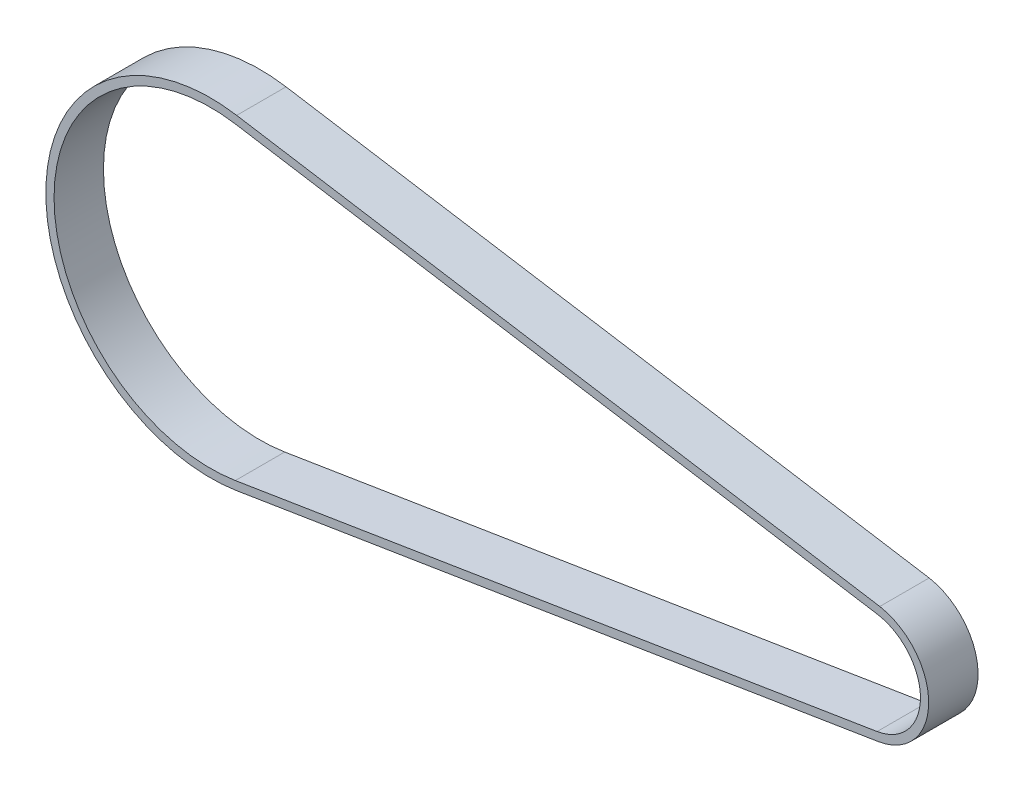
ISO-10303-21;
HEADER;
FILE_DESCRIPTION(('STEP AP214'),'2;1');
FILE_NAME('part.step','',(''),(''),'','','');
FILE_SCHEMA(('AUTOMOTIVE_DESIGN { 1 0 10303 214 1 1 1 1 }'));
ENDSEC;
DATA;
#1=APPLICATION_CONTEXT('core data for automotive mechanical design processes');
#2=APPLICATION_PROTOCOL_DEFINITION('international standard','automotive_design',2000,#1);
#3=PRODUCT_CONTEXT('',#1,'mechanical');
#4=PRODUCT('Part','Part','',(#3));
#5=PRODUCT_RELATED_PRODUCT_CATEGORY('part','',(#4));
#6=PRODUCT_DEFINITION_FORMATION('','',#4);
#7=PRODUCT_DEFINITION_CONTEXT('part definition',#1,'design');
#8=PRODUCT_DEFINITION('design','',#6,#7);
#9=PRODUCT_DEFINITION_SHAPE('','',#8);
#10=(LENGTH_UNIT() NAMED_UNIT(*) SI_UNIT(.MILLI.,.METRE.));
#11=(NAMED_UNIT(*) PLANE_ANGLE_UNIT() SI_UNIT($,.RADIAN.));
#12=(NAMED_UNIT(*) SI_UNIT($,.STERADIAN.) SOLID_ANGLE_UNIT());
#13=UNCERTAINTY_MEASURE_WITH_UNIT(LENGTH_MEASURE(1.E-05),#10,'distance_accuracy_value','');
#14=(GEOMETRIC_REPRESENTATION_CONTEXT(3) GLOBAL_UNCERTAINTY_ASSIGNED_CONTEXT((#13)) GLOBAL_UNIT_ASSIGNED_CONTEXT((#10,
#11,#12)) REPRESENTATION_CONTEXT('',''));
#15=CARTESIAN_POINT('',(0.,0.,0.));
#16=DIRECTION('',(0.,0.,1.));
#17=DIRECTION('',(1.,0.,0.));
#18=AXIS2_PLACEMENT_3D('',#15,#16,#17);
#19=CARTESIAN_POINT('',(0.,0.,6.));
#20=DIRECTION('',(0.,0.,1.));
#21=DIRECTION('',(1.,0.,0.));
#22=AXIS2_PLACEMENT_3D('',#19,#20,#21);
#23=PLANE('',#22);
#24=CARTESIAN_POINT('',(0.,0.,6.));
#25=DIRECTION('',(0.,0.,1.));
#26=DIRECTION('',(1.,0.,0.));
#27=AXIS2_PLACEMENT_3D('',#24,#25,#26);
#28=CIRCLE('',#27,20.);
#29=CARTESIAN_POINT('',(3.18547285903832,19.7446894800686,6.));
#30=VERTEX_POINT('',#29);
#31=CARTESIAN_POINT('',(3.185,-19.744765762095,6.));
#32=VERTEX_POINT('',#31);
#33=EDGE_CURVE('E139',#30,#32,#28,.T.);
#34=ORIENTED_EDGE('',*,*,#33,.T.);
#35=DIRECTION('',(0.987238288104751,0.15925,0.));
#36=VECTOR('',#35,1.);
#37=CARTESIAN_POINT('',(3.185,-19.744765762095,6.));
#38=LINE('',#37,#36);
#39=CARTESIAN_POINT('',(81.156155,-7.1673499716405,6.));
#40=VERTEX_POINT('',#39);
#41=EDGE_CURVE('E142',#32,#40,#38,.T.);
#42=ORIENTED_EDGE('',*,*,#41,.T.);
#43=CARTESIAN_POINT('',(80.,0.,6.));
#44=DIRECTION('',(0.,0.,1.));
#45=DIRECTION('',(1.,0.,0.));
#46=AXIS2_PLACEMENT_3D('',#43,#44,#45);
#47=CIRCLE('',#46,7.26);
#48=CARTESIAN_POINT('',(81.3196208247821,7.13906162452751,6.));
#49=VERTEX_POINT('',#48);
#50=EDGE_CURVE('E145',#40,#49,#47,.T.);
#51=ORIENTED_EDGE('',*,*,#50,.T.);
#52=DIRECTION('',(-0.987234474003428,0.159273642951916,0.));
#53=VECTOR('',#52,1.);
#54=CARTESIAN_POINT('',(3.18547285903832,19.7446894800686,6.));
#55=LINE('',#54,#53);
#56=EDGE_CURVE('E147',#49,#30,#55,.T.);
#57=ORIENTED_EDGE('',*,*,#56,.T.);
#58=EDGE_LOOP('',(#34,#42,#51,#57));
#59=FACE_BOUND('',#58,.T.);
#60=DIRECTION('',(0.987238288104751,0.15925,0.));
#61=VECTOR('',#60,1.);
#62=CARTESIAN_POINT('',(3.02575,-18.7575274739903,6.));
#63=LINE('',#62,#61);
#64=CARTESIAN_POINT('',(3.02575,-18.7575274739903,6.));
#65=VERTEX_POINT('',#64);
#66=CARTESIAN_POINT('',(80.996905,-6.18011168353574,6.));
#67=VERTEX_POINT('',#66);
#68=EDGE_CURVE('E111',#65,#67,#63,.T.);
#69=ORIENTED_EDGE('',*,*,#68,.F.);
#70=CARTESIAN_POINT('',(0.,0.,6.));
#71=DIRECTION('',(0.,0.,1.));
#72=DIRECTION('',(1.,0.,0.));
#73=AXIS2_PLACEMENT_3D('',#70,#71,#72);
#74=CIRCLE('',#73,19.);
#75=CARTESIAN_POINT('',(3.02575,18.7575274739903,6.));
#76=VERTEX_POINT('',#75);
#77=EDGE_CURVE('E103',#76,#65,#74,.T.);
#78=ORIENTED_EDGE('',*,*,#77,.F.);
#79=DIRECTION('',(-0.987238288104751,0.15925,0.));
#80=VECTOR('',#79,1.);
#81=CARTESIAN_POINT('',(3.02575,18.7575274739903,6.));
#82=LINE('',#81,#80);
#83=CARTESIAN_POINT('',(80.996905,6.18011168353574,6.));
#84=VERTEX_POINT('',#83);
#85=EDGE_CURVE('E125',#84,#76,#82,.T.);
#86=ORIENTED_EDGE('',*,*,#85,.F.);
#87=CARTESIAN_POINT('',(80.,0.,6.));
#88=DIRECTION('',(0.,0.,1.));
#89=DIRECTION('',(1.,0.,0.));
#90=AXIS2_PLACEMENT_3D('',#87,#88,#89);
#91=CIRCLE('',#90,6.26);
#92=EDGE_CURVE('E123',#67,#84,#91,.T.);
#93=ORIENTED_EDGE('',*,*,#92,.F.);
#94=EDGE_LOOP('',(#69,#78,#86,#93));
#95=FACE_BOUND('',#94,.T.);
#96=ADVANCED_FACE('F38',(#59,#95),#23,.T.);
#97=CARTESIAN_POINT('',(0.,0.,0.));
#98=DIRECTION('',(0.,0.,1.));
#99=DIRECTION('',(1.,0.,0.));
#100=AXIS2_PLACEMENT_3D('',#97,#98,#99);
#101=PLANE('',#100);
#102=CARTESIAN_POINT('',(0.,0.,0.));
#103=DIRECTION('',(0.,0.,1.));
#104=DIRECTION('',(1.,0.,0.));
#105=AXIS2_PLACEMENT_3D('',#102,#103,#104);
#106=CIRCLE('',#105,20.);
#107=CARTESIAN_POINT('',(3.18547285903832,19.7446894800686,0.));
#108=VERTEX_POINT('',#107);
#109=CARTESIAN_POINT('',(3.185,-19.744765762095,0.));
#110=VERTEX_POINT('',#109);
#111=EDGE_CURVE('E119',#108,#110,#106,.T.);
#112=ORIENTED_EDGE('',*,*,#111,.F.);
#113=DIRECTION('',(-0.987234474003428,0.159273642951916,0.));
#114=VECTOR('',#113,1.);
#115=CARTESIAN_POINT('',(3.18547285903832,19.7446894800686,0.));
#116=LINE('',#115,#114);
#117=CARTESIAN_POINT('',(81.3196208247821,7.13906162452751,0.));
#118=VERTEX_POINT('',#117);
#119=EDGE_CURVE('E143',#118,#108,#116,.T.);
#120=ORIENTED_EDGE('',*,*,#119,.F.);
#121=CARTESIAN_POINT('',(80.,0.,0.));
#122=DIRECTION('',(0.,0.,1.));
#123=DIRECTION('',(1.,0.,0.));
#124=AXIS2_PLACEMENT_3D('',#121,#122,#123);
#125=CIRCLE('',#124,7.26);
#126=CARTESIAN_POINT('',(81.156155,-7.1673499716405,0.));
#127=VERTEX_POINT('',#126);
#128=EDGE_CURVE('E154',#127,#118,#125,.T.);
#129=ORIENTED_EDGE('',*,*,#128,.F.);
#130=DIRECTION('',(0.987238288104751,0.15925,0.));
#131=VECTOR('',#130,1.);
#132=CARTESIAN_POINT('',(3.185,-19.744765762095,0.));
#133=LINE('',#132,#131);
#134=EDGE_CURVE('E152',#110,#127,#133,.T.);
#135=ORIENTED_EDGE('',*,*,#134,.F.);
#136=EDGE_LOOP('',(#112,#120,#129,#135));
#137=FACE_BOUND('',#136,.T.);
#138=CARTESIAN_POINT('',(0.,0.,0.));
#139=DIRECTION('',(0.,0.,1.));
#140=DIRECTION('',(1.,0.,0.));
#141=AXIS2_PLACEMENT_3D('',#138,#139,#140);
#142=CIRCLE('',#141,19.);
#143=CARTESIAN_POINT('',(3.02575,18.7575274739903,0.));
#144=VERTEX_POINT('',#143);
#145=CARTESIAN_POINT('',(3.02575,-18.7575274739903,0.));
#146=VERTEX_POINT('',#145);
#147=EDGE_CURVE('E61',#144,#146,#142,.T.);
#148=ORIENTED_EDGE('',*,*,#147,.T.);
#149=DIRECTION('',(0.987238288104751,0.15925,0.));
#150=VECTOR('',#149,1.);
#151=CARTESIAN_POINT('',(3.02575,-18.7575274739903,0.));
#152=LINE('',#151,#150);
#153=CARTESIAN_POINT('',(80.996905,-6.18011168353574,0.));
#154=VERTEX_POINT('',#153);
#155=EDGE_CURVE('E118',#146,#154,#152,.T.);
#156=ORIENTED_EDGE('',*,*,#155,.T.);
#157=CARTESIAN_POINT('',(80.,0.,0.));
#158=DIRECTION('',(0.,0.,1.));
#159=DIRECTION('',(1.,0.,0.));
#160=AXIS2_PLACEMENT_3D('',#157,#158,#159);
#161=CIRCLE('',#160,6.26);
#162=CARTESIAN_POINT('',(80.996905,6.18011168353574,0.));
#163=VERTEX_POINT('',#162);
#164=EDGE_CURVE('E131',#154,#163,#161,.T.);
#165=ORIENTED_EDGE('',*,*,#164,.T.);
#166=DIRECTION('',(-0.987238288104751,0.15925,0.));
#167=VECTOR('',#166,1.);
#168=CARTESIAN_POINT('',(3.02575,18.7575274739903,0.));
#169=LINE('',#168,#167);
#170=EDGE_CURVE('E112',#163,#144,#169,.T.);
#171=ORIENTED_EDGE('',*,*,#170,.T.);
#172=EDGE_LOOP('',(#148,#156,#165,#171));
#173=FACE_BOUND('',#172,.T.);
#174=ADVANCED_FACE('F172',(#137,#173),#101,.F.);
#175=CARTESIAN_POINT('',(0.,0.,6.));
#176=DIRECTION('',(0.,0.,-1.));
#177=DIRECTION('',(-1.,0.,0.));
#178=AXIS2_PLACEMENT_3D('',#175,#176,#177);
#179=CYLINDRICAL_SURFACE('',#178,20.);
#180=ORIENTED_EDGE('',*,*,#111,.T.);
#181=DIRECTION('',(0.,0.,-1.));
#182=VECTOR('',#181,1.);
#183=CARTESIAN_POINT('',(3.185,-19.744765762095,6.));
#184=LINE('',#183,#182);
#185=EDGE_CURVE('E11',#32,#110,#184,.T.);
#186=ORIENTED_EDGE('',*,*,#185,.F.);
#187=ORIENTED_EDGE('',*,*,#33,.F.);
#188=DIRECTION('',(0.,0.,-1.));
#189=VECTOR('',#188,1.);
#190=CARTESIAN_POINT('',(3.18547285903832,19.7446894800686,6.));
#191=LINE('',#190,#189);
#192=EDGE_CURVE('E149',#30,#108,#191,.T.);
#193=ORIENTED_EDGE('',*,*,#192,.T.);
#194=EDGE_LOOP('',(#180,#186,#187,#193));
#195=FACE_BOUND('',#194,.T.);
#196=ADVANCED_FACE('F40',(#195),#179,.T.);
#197=CARTESIAN_POINT('',(3.185,-19.744765762095,6.));
#198=DIRECTION('',(-0.15925,0.987238288104751,0.));
#199=DIRECTION('',(-0.987238288104751,-0.15925,0.));
#200=AXIS2_PLACEMENT_3D('',#197,#198,#199);
#201=PLANE('',#200);
#202=ORIENTED_EDGE('',*,*,#134,.T.);
#203=DIRECTION('',(0.,0.,-1.));
#204=VECTOR('',#203,1.);
#205=CARTESIAN_POINT('',(81.156155,-7.1673499716405,6.));
#206=LINE('',#205,#204);
#207=EDGE_CURVE('E46',#40,#127,#206,.T.);
#208=ORIENTED_EDGE('',*,*,#207,.F.);
#209=ORIENTED_EDGE('',*,*,#41,.F.);
#210=ORIENTED_EDGE('',*,*,#185,.T.);
#211=EDGE_LOOP('',(#202,#208,#209,#210));
#212=FACE_BOUND('',#211,.T.);
#213=ADVANCED_FACE('F182',(#212),#201,.F.);
#214=CARTESIAN_POINT('',(80.,0.,6.));
#215=DIRECTION('',(0.,0.,-1.));
#216=DIRECTION('',(-1.,0.,0.));
#217=AXIS2_PLACEMENT_3D('',#214,#215,#216);
#218=CYLINDRICAL_SURFACE('',#217,7.26);
#219=ORIENTED_EDGE('',*,*,#128,.T.);
#220=DIRECTION('',(0.,0.,-1.));
#221=VECTOR('',#220,1.);
#222=CARTESIAN_POINT('',(81.3196208247821,7.13906162452751,6.));
#223=LINE('',#222,#221);
#224=EDGE_CURVE('E159',#49,#118,#223,.T.);
#225=ORIENTED_EDGE('',*,*,#224,.F.);
#226=ORIENTED_EDGE('',*,*,#50,.F.);
#227=ORIENTED_EDGE('',*,*,#207,.T.);
#228=EDGE_LOOP('',(#219,#225,#226,#227));
#229=FACE_BOUND('',#228,.T.);
#230=ADVANCED_FACE('F166',(#229),#218,.T.);
#231=CARTESIAN_POINT('',(3.18547285903832,19.7446894800686,6.));
#232=DIRECTION('',(-0.159273642951916,-0.987234474003428,0.));
#233=DIRECTION('',(0.987234474003428,-0.159273642951916,0.));
#234=AXIS2_PLACEMENT_3D('',#231,#232,#233);
#235=PLANE('',#234);
#236=ORIENTED_EDGE('',*,*,#119,.T.);
#237=ORIENTED_EDGE('',*,*,#192,.F.);
#238=ORIENTED_EDGE('',*,*,#56,.F.);
#239=ORIENTED_EDGE('',*,*,#224,.T.);
#240=EDGE_LOOP('',(#236,#237,#238,#239));
#241=FACE_BOUND('',#240,.T.);
#242=ADVANCED_FACE('F176',(#241),#235,.F.);
#243=CARTESIAN_POINT('',(0.,0.,6.));
#244=DIRECTION('',(0.,0.,-1.));
#245=DIRECTION('',(-1.,0.,0.));
#246=AXIS2_PLACEMENT_3D('',#243,#244,#245);
#247=CYLINDRICAL_SURFACE('',#246,19.);
#248=ORIENTED_EDGE('',*,*,#147,.F.);
#249=DIRECTION('',(0.,0.,-1.));
#250=VECTOR('',#249,1.);
#251=CARTESIAN_POINT('',(3.02575,18.7575274739903,6.));
#252=LINE('',#251,#250);
#253=EDGE_CURVE('E107',#76,#144,#252,.T.);
#254=ORIENTED_EDGE('',*,*,#253,.F.);
#255=ORIENTED_EDGE('',*,*,#77,.T.);
#256=DIRECTION('',(0.,0.,-1.));
#257=VECTOR('',#256,1.);
#258=CARTESIAN_POINT('',(3.02575,-18.7575274739903,6.));
#259=LINE('',#258,#257);
#260=EDGE_CURVE('E106',#65,#146,#259,.T.);
#261=ORIENTED_EDGE('',*,*,#260,.T.);
#262=EDGE_LOOP('',(#248,#254,#255,#261));
#263=FACE_BOUND('',#262,.T.);
#264=ADVANCED_FACE('F105',(#263),#247,.F.);
#265=CARTESIAN_POINT('',(3.02575,-18.7575274739903,6.));
#266=DIRECTION('',(-0.15925,0.987238288104751,0.));
#267=DIRECTION('',(-0.987238288104751,-0.15925,0.));
#268=AXIS2_PLACEMENT_3D('',#265,#266,#267);
#269=PLANE('',#268);
#270=ORIENTED_EDGE('',*,*,#155,.F.);
#271=ORIENTED_EDGE('',*,*,#260,.F.);
#272=ORIENTED_EDGE('',*,*,#68,.T.);
#273=DIRECTION('',(0.,0.,-1.));
#274=VECTOR('',#273,1.);
#275=CARTESIAN_POINT('',(80.996905,-6.18011168353574,6.));
#276=LINE('',#275,#274);
#277=EDGE_CURVE('E120',#67,#154,#276,.T.);
#278=ORIENTED_EDGE('',*,*,#277,.T.);
#279=EDGE_LOOP('',(#270,#271,#272,#278));
#280=FACE_BOUND('',#279,.T.);
#281=ADVANCED_FACE('F115',(#280),#269,.T.);
#282=CARTESIAN_POINT('',(80.,0.,6.));
#283=DIRECTION('',(0.,0.,-1.));
#284=DIRECTION('',(-1.,0.,0.));
#285=AXIS2_PLACEMENT_3D('',#282,#283,#284);
#286=CYLINDRICAL_SURFACE('',#285,6.26);
#287=ORIENTED_EDGE('',*,*,#164,.F.);
#288=ORIENTED_EDGE('',*,*,#277,.F.);
#289=ORIENTED_EDGE('',*,*,#92,.T.);
#290=DIRECTION('',(0.,0.,-1.));
#291=VECTOR('',#290,1.);
#292=CARTESIAN_POINT('',(80.996905,6.18011168353574,6.));
#293=LINE('',#292,#291);
#294=EDGE_CURVE('E53',#84,#163,#293,.T.);
#295=ORIENTED_EDGE('',*,*,#294,.T.);
#296=EDGE_LOOP('',(#287,#288,#289,#295));
#297=FACE_BOUND('',#296,.T.);
#298=ADVANCED_FACE('F205',(#297),#286,.F.);
#299=CARTESIAN_POINT('',(3.02575,18.7575274739903,6.));
#300=DIRECTION('',(-0.15925,-0.987238288104751,0.));
#301=DIRECTION('',(0.987238288104751,-0.15925,0.));
#302=AXIS2_PLACEMENT_3D('',#299,#300,#301);
#303=PLANE('',#302);
#304=ORIENTED_EDGE('',*,*,#170,.F.);
#305=ORIENTED_EDGE('',*,*,#294,.F.);
#306=ORIENTED_EDGE('',*,*,#85,.T.);
#307=ORIENTED_EDGE('',*,*,#253,.T.);
#308=EDGE_LOOP('',(#304,#305,#306,#307));
#309=FACE_BOUND('',#308,.T.);
#310=ADVANCED_FACE('F209',(#309),#303,.T.);
#311=CLOSED_SHELL('',(#96,#174,#196,#213,#230,#242,#264,#281,#298,#310));
#312=MANIFOLD_SOLID_BREP('B2',#311);
#313=ADVANCED_BREP_SHAPE_REPRESENTATION('',(#18,#312),#14);
#314=SHAPE_DEFINITION_REPRESENTATION(#9,#313);
ENDSEC;
END-ISO-10303-21;
